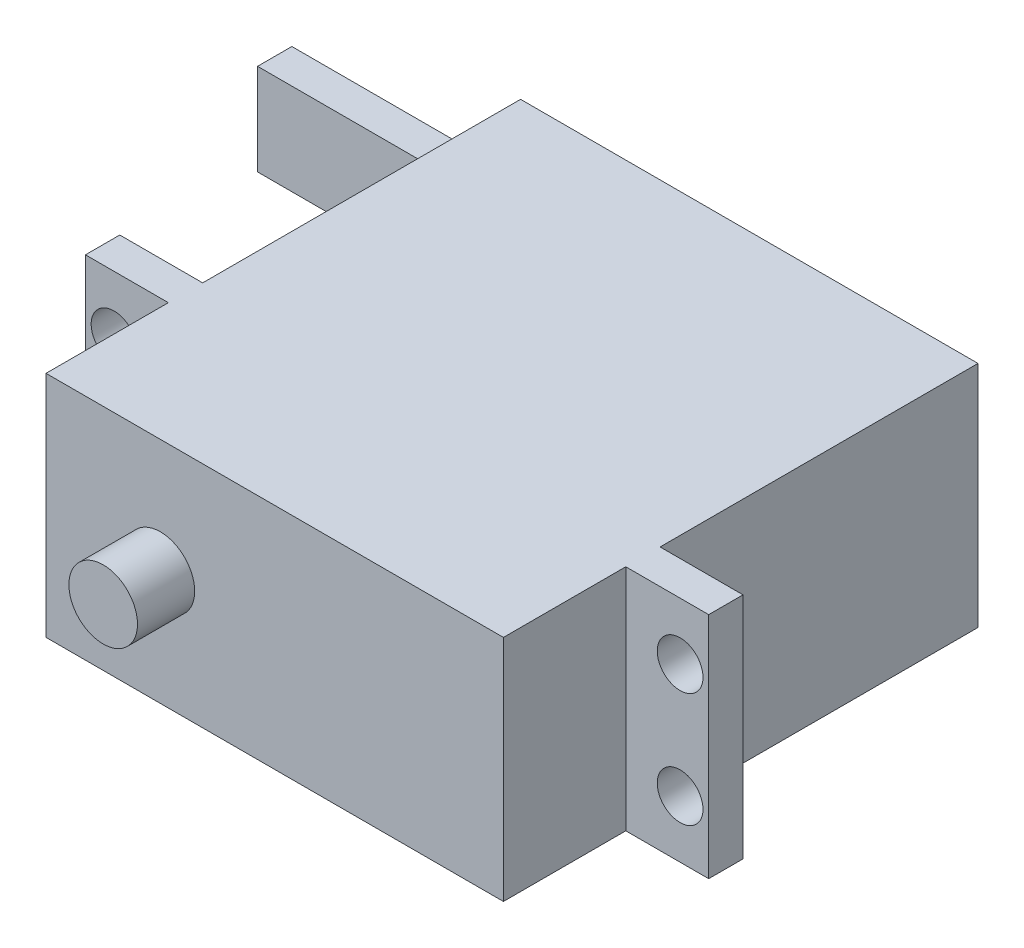
ISO-10303-21;
HEADER;
FILE_DESCRIPTION(('STEP AP214'),'2;1');
FILE_NAME('part.step','',(''),(''),'','','');
FILE_SCHEMA(('AUTOMOTIVE_DESIGN { 1 0 10303 214 1 1 1 1 }'));
ENDSEC;
DATA;
#1=APPLICATION_CONTEXT('core data for automotive mechanical design processes');
#2=APPLICATION_PROTOCOL_DEFINITION('international standard','automotive_design',2000,#1);
#3=PRODUCT_CONTEXT('',#1,'mechanical');
#4=PRODUCT('Part','Part','',(#3));
#5=PRODUCT_RELATED_PRODUCT_CATEGORY('part','',(#4));
#6=PRODUCT_DEFINITION_FORMATION('','',#4);
#7=PRODUCT_DEFINITION_CONTEXT('part definition',#1,'design');
#8=PRODUCT_DEFINITION('design','',#6,#7);
#9=PRODUCT_DEFINITION_SHAPE('','',#8);
#10=(LENGTH_UNIT() NAMED_UNIT(*) SI_UNIT(.MILLI.,.METRE.));
#11=(NAMED_UNIT(*) PLANE_ANGLE_UNIT() SI_UNIT($,.RADIAN.));
#12=(NAMED_UNIT(*) SI_UNIT($,.STERADIAN.) SOLID_ANGLE_UNIT());
#13=UNCERTAINTY_MEASURE_WITH_UNIT(LENGTH_MEASURE(1.E-05),#10,'distance_accuracy_value','');
#14=(GEOMETRIC_REPRESENTATION_CONTEXT(3) GLOBAL_UNCERTAINTY_ASSIGNED_CONTEXT((#13)) GLOBAL_UNIT_ASSIGNED_CONTEXT((#10,
#11,#12)) REPRESENTATION_CONTEXT('',''));
#15=CARTESIAN_POINT('',(0.,0.,0.));
#16=DIRECTION('',(0.,0.,1.));
#17=DIRECTION('',(1.,0.,0.));
#18=AXIS2_PLACEMENT_3D('',#15,#16,#17);
#19=CARTESIAN_POINT('',(-10.,10.,-44.));
#20=DIRECTION('',(1.,0.,0.));
#21=DIRECTION('',(0.,0.,-1.));
#22=AXIS2_PLACEMENT_3D('',#19,#20,#21);
#23=PLANE('',#22);
#24=DIRECTION('',(0.,0.,1.));
#25=VECTOR('',#24,1.);
#26=CARTESIAN_POINT('',(-10.,-4.,-44.));
#27=LINE('',#26,#25);
#28=CARTESIAN_POINT('',(-10.,-4.,-44.));
#29=VERTEX_POINT('',#28);
#30=CARTESIAN_POINT('',(-10.,-4.,-41.));
#31=VERTEX_POINT('',#30);
#32=EDGE_CURVE('E341',#29,#31,#27,.T.);
#33=ORIENTED_EDGE('',*,*,#32,.F.);
#34=DIRECTION('',(0.,1.,0.));
#35=VECTOR('',#34,1.);
#36=CARTESIAN_POINT('',(-10.,10.,-44.));
#37=LINE('',#36,#35);
#38=CARTESIAN_POINT('',(-10.,-10.,-44.));
#39=VERTEX_POINT('',#38);
#40=EDGE_CURVE('E170',#39,#29,#37,.T.);
#41=ORIENTED_EDGE('',*,*,#40,.F.);
#42=DIRECTION('',(0.,0.,1.));
#43=VECTOR('',#42,1.);
#44=CARTESIAN_POINT('',(-10.,-10.,-44.));
#45=LINE('',#44,#43);
#46=CARTESIAN_POINT('',(-10.,-10.,-16.2));
#47=VERTEX_POINT('',#46);
#48=EDGE_CURVE('E269',#39,#47,#45,.T.);
#49=ORIENTED_EDGE('',*,*,#48,.T.);
#50=DIRECTION('',(0.,-1.,0.));
#51=VECTOR('',#50,1.);
#52=CARTESIAN_POINT('',(-10.,10.,-16.2));
#53=LINE('',#52,#51);
#54=CARTESIAN_POINT('',(-10.,10.,-16.2));
#55=VERTEX_POINT('',#54);
#56=EDGE_CURVE('E201',#55,#47,#53,.T.);
#57=ORIENTED_EDGE('',*,*,#56,.F.);
#58=DIRECTION('',(0.,0.,1.));
#59=VECTOR('',#58,1.);
#60=CARTESIAN_POINT('',(-10.,10.,-44.));
#61=LINE('',#60,#59);
#62=CARTESIAN_POINT('',(-10.,10.,-44.));
#63=VERTEX_POINT('',#62);
#64=EDGE_CURVE('E265',#63,#55,#61,.T.);
#65=ORIENTED_EDGE('',*,*,#64,.F.);
#66=CARTESIAN_POINT('',(-10.,4.,-44.));
#67=VERTEX_POINT('',#66);
#68=EDGE_CURVE('E246',#67,#63,#37,.T.);
#69=ORIENTED_EDGE('',*,*,#68,.F.);
#70=DIRECTION('',(0.,0.,-1.));
#71=VECTOR('',#70,1.);
#72=CARTESIAN_POINT('',(-10.,4.,-44.));
#73=LINE('',#72,#71);
#74=CARTESIAN_POINT('',(-10.,4.,-41.));
#75=VERTEX_POINT('',#74);
#76=EDGE_CURVE('E164',#75,#67,#73,.T.);
#77=ORIENTED_EDGE('',*,*,#76,.F.);
#78=DIRECTION('',(0.,1.,0.));
#79=VECTOR('',#78,1.);
#80=CARTESIAN_POINT('',(-10.,4.,-41.));
#81=LINE('',#80,#79);
#82=EDGE_CURVE('E343',#31,#75,#81,.T.);
#83=ORIENTED_EDGE('',*,*,#82,.F.);
#84=EDGE_LOOP('',(#33,#41,#49,#57,#65,#69,#77,#83));
#85=FACE_BOUND('',#84,.T.);
#86=ADVANCED_FACE('F32',(#85),#23,.F.);
#87=CARTESIAN_POINT('',(30.,10.,-44.));
#88=DIRECTION('',(-1.,0.,0.));
#89=DIRECTION('',(0.,0.,1.));
#90=AXIS2_PLACEMENT_3D('',#87,#88,#89);
#91=PLANE('',#90);
#92=DIRECTION('',(0.,1.,0.));
#93=VECTOR('',#92,1.);
#94=CARTESIAN_POINT('',(30.,10.,-16.2));
#95=LINE('',#94,#93);
#96=CARTESIAN_POINT('',(30.,-10.,-16.2));
#97=VERTEX_POINT('',#96);
#98=CARTESIAN_POINT('',(30.,10.,-16.2));
#99=VERTEX_POINT('',#98);
#100=EDGE_CURVE('E233',#97,#99,#95,.T.);
#101=ORIENTED_EDGE('',*,*,#100,.F.);
#102=DIRECTION('',(0.,0.,1.));
#103=VECTOR('',#102,1.);
#104=CARTESIAN_POINT('',(30.,-10.,-44.));
#105=LINE('',#104,#103);
#106=CARTESIAN_POINT('',(30.,-10.,-44.));
#107=VERTEX_POINT('',#106);
#108=EDGE_CURVE('E273',#107,#97,#105,.T.);
#109=ORIENTED_EDGE('',*,*,#108,.F.);
#110=DIRECTION('',(0.,-1.,0.));
#111=VECTOR('',#110,1.);
#112=CARTESIAN_POINT('',(30.,10.,-44.));
#113=LINE('',#112,#111);
#114=CARTESIAN_POINT('',(30.,10.,-44.));
#115=VERTEX_POINT('',#114);
#116=EDGE_CURVE('E241',#115,#107,#113,.T.);
#117=ORIENTED_EDGE('',*,*,#116,.F.);
#118=DIRECTION('',(0.,0.,1.));
#119=VECTOR('',#118,1.);
#120=CARTESIAN_POINT('',(30.,10.,-44.));
#121=LINE('',#120,#119);
#122=EDGE_CURVE('E261',#115,#99,#121,.T.);
#123=ORIENTED_EDGE('',*,*,#122,.T.);
#124=EDGE_LOOP('',(#101,#109,#117,#123));
#125=FACE_BOUND('',#124,.T.);
#126=ADVANCED_FACE('F312',(#125),#91,.F.);
#127=CARTESIAN_POINT('',(0.,0.,-2.5));
#128=DIRECTION('',(0.,0.,1.));
#129=DIRECTION('',(1.,0.,0.));
#130=AXIS2_PLACEMENT_3D('',#127,#128,#129);
#131=CYLINDRICAL_SURFACE('',#130,3.);
#132=CARTESIAN_POINT('',(0.,0.,-2.5));
#133=DIRECTION('',(0.,0.,-1.));
#134=DIRECTION('',(-1.,0.,0.));
#135=AXIS2_PLACEMENT_3D('',#132,#133,#134);
#136=CIRCLE('',#135,3.);
#137=CARTESIAN_POINT('',(-3.,0.,-2.5));
#138=VERTEX_POINT('',#137);
#139=EDGE_CURVE('E41',#138,#138,#136,.F.);
#140=ORIENTED_EDGE('',*,*,#139,.T.);
#141=EDGE_LOOP('',(#140));
#142=FACE_BOUND('',#141,.T.);
#143=CARTESIAN_POINT('',(0.,0.,2.5));
#144=DIRECTION('',(0.,0.,1.));
#145=DIRECTION('',(1.,0.,0.));
#146=AXIS2_PLACEMENT_3D('',#143,#144,#145);
#147=CIRCLE('',#146,3.);
#148=CARTESIAN_POINT('',(3.,0.,2.5));
#149=VERTEX_POINT('',#148);
#150=EDGE_CURVE('E11',#149,#149,#147,.T.);
#151=ORIENTED_EDGE('',*,*,#150,.F.);
#152=EDGE_LOOP('',(#151));
#153=FACE_BOUND('',#152,.T.);
#154=ADVANCED_FACE('F34',(#142,#153),#131,.T.);
#155=CARTESIAN_POINT('',(0.,0.,2.5));
#156=DIRECTION('',(0.,0.,1.));
#157=DIRECTION('',(1.,0.,0.));
#158=AXIS2_PLACEMENT_3D('',#155,#156,#157);
#159=PLANE('',#158);
#160=ORIENTED_EDGE('',*,*,#150,.T.);
#161=EDGE_LOOP('',(#160));
#162=FACE_BOUND('',#161,.T.);
#163=ADVANCED_FACE('F388',(#162),#159,.T.);
#164=CARTESIAN_POINT('',(30.,-10.,-13.2));
#165=VERTEX_POINT('',#164);
#166=CARTESIAN_POINT('',(30.,-10.,-2.5));
#167=VERTEX_POINT('',#166);
#168=EDGE_CURVE('E272',#165,#167,#105,.T.);
#169=ORIENTED_EDGE('',*,*,#168,.F.);
#170=DIRECTION('',(0.,1.,0.));
#171=VECTOR('',#170,1.);
#172=CARTESIAN_POINT('',(30.,10.,-13.2));
#173=LINE('',#172,#171);
#174=CARTESIAN_POINT('',(30.,10.,-13.2));
#175=VERTEX_POINT('',#174);
#176=EDGE_CURVE('E222',#165,#175,#173,.T.);
#177=ORIENTED_EDGE('',*,*,#176,.T.);
#178=CARTESIAN_POINT('',(30.,10.,-2.5));
#179=VERTEX_POINT('',#178);
#180=EDGE_CURVE('E250',#175,#179,#121,.T.);
#181=ORIENTED_EDGE('',*,*,#180,.T.);
#182=DIRECTION('',(0.,-1.,0.));
#183=VECTOR('',#182,1.);
#184=CARTESIAN_POINT('',(30.,10.,-2.5));
#185=LINE('',#184,#183);
#186=EDGE_CURVE('E239',#179,#167,#185,.T.);
#187=ORIENTED_EDGE('',*,*,#186,.T.);
#188=EDGE_LOOP('',(#169,#177,#181,#187));
#189=FACE_BOUND('',#188,.T.);
#190=ADVANCED_FACE('F321',(#189),#91,.F.);
#191=CARTESIAN_POINT('',(30.,-10.,-44.));
#192=DIRECTION('',(0.,1.,0.));
#193=DIRECTION('',(0.,0.,1.));
#194=AXIS2_PLACEMENT_3D('',#191,#192,#193);
#195=PLANE('',#194);
#196=DIRECTION('',(-1.,0.,0.));
#197=VECTOR('',#196,1.);
#198=CARTESIAN_POINT('',(30.,-10.,-2.5));
#199=LINE('',#198,#197);
#200=CARTESIAN_POINT('',(-10.,-10.,-2.5));
#201=VERTEX_POINT('',#200);
#202=EDGE_CURVE('E253',#167,#201,#199,.T.);
#203=ORIENTED_EDGE('',*,*,#202,.T.);
#204=CARTESIAN_POINT('',(-10.,-10.,-13.2));
#205=VERTEX_POINT('',#204);
#206=EDGE_CURVE('E268',#205,#201,#45,.T.);
#207=ORIENTED_EDGE('',*,*,#206,.F.);
#208=DIRECTION('',(-1.,0.,0.));
#209=VECTOR('',#208,1.);
#210=CARTESIAN_POINT('',(-10.,-10.,-13.2));
#211=LINE('',#210,#209);
#212=CARTESIAN_POINT('',(-17.25,-10.,-13.2));
#213=VERTEX_POINT('',#212);
#214=EDGE_CURVE('E57',#205,#213,#211,.T.);
#215=ORIENTED_EDGE('',*,*,#214,.T.);
#216=DIRECTION('',(0.,0.,-1.));
#217=VECTOR('',#216,1.);
#218=CARTESIAN_POINT('',(-17.25,-10.,-13.2));
#219=LINE('',#218,#217);
#220=CARTESIAN_POINT('',(-17.25,-10.,-16.2));
#221=VERTEX_POINT('',#220);
#222=EDGE_CURVE('E200',#213,#221,#219,.T.);
#223=ORIENTED_EDGE('',*,*,#222,.T.);
#224=DIRECTION('',(-1.,0.,0.));
#225=VECTOR('',#224,1.);
#226=CARTESIAN_POINT('',(-10.,-10.,-16.2));
#227=LINE('',#226,#225);
#228=EDGE_CURVE('E204',#47,#221,#227,.T.);
#229=ORIENTED_EDGE('',*,*,#228,.F.);
#230=ORIENTED_EDGE('',*,*,#48,.F.);
#231=DIRECTION('',(-1.,0.,0.));
#232=VECTOR('',#231,1.);
#233=CARTESIAN_POINT('',(30.,-10.,-44.));
#234=LINE('',#233,#232);
#235=EDGE_CURVE('E243',#107,#39,#234,.T.);
#236=ORIENTED_EDGE('',*,*,#235,.F.);
#237=ORIENTED_EDGE('',*,*,#108,.T.);
#238=DIRECTION('',(-1.,0.,0.));
#239=VECTOR('',#238,1.);
#240=CARTESIAN_POINT('',(37.25,-10.,-16.2));
#241=LINE('',#240,#239);
#242=CARTESIAN_POINT('',(37.25,-10.,-16.2));
#243=VERTEX_POINT('',#242);
#244=EDGE_CURVE('E231',#243,#97,#241,.T.);
#245=ORIENTED_EDGE('',*,*,#244,.F.);
#246=DIRECTION('',(0.,0.,-1.));
#247=VECTOR('',#246,1.);
#248=CARTESIAN_POINT('',(37.25,-10.,-13.2));
#249=LINE('',#248,#247);
#250=CARTESIAN_POINT('',(37.25,-10.,-13.2));
#251=VERTEX_POINT('',#250);
#252=EDGE_CURVE('E228',#251,#243,#249,.T.);
#253=ORIENTED_EDGE('',*,*,#252,.F.);
#254=DIRECTION('',(-1.,0.,0.));
#255=VECTOR('',#254,1.);
#256=CARTESIAN_POINT('',(37.25,-10.,-13.2));
#257=LINE('',#256,#255);
#258=EDGE_CURVE('E218',#251,#165,#257,.T.);
#259=ORIENTED_EDGE('',*,*,#258,.T.);
#260=ORIENTED_EDGE('',*,*,#168,.T.);
#261=EDGE_LOOP('',(#203,#207,#215,#223,#229,#230,#236,#237,#245,#253,#259,#260));
#262=FACE_BOUND('',#261,.T.);
#263=ADVANCED_FACE('F307',(#262),#195,.F.);
#264=CARTESIAN_POINT('',(-10.,10.,-13.2));
#265=VERTEX_POINT('',#264);
#266=CARTESIAN_POINT('',(-10.,10.,-2.5));
#267=VERTEX_POINT('',#266);
#268=EDGE_CURVE('E264',#265,#267,#61,.T.);
#269=ORIENTED_EDGE('',*,*,#268,.F.);
#270=DIRECTION('',(0.,-1.,0.));
#271=VECTOR('',#270,1.);
#272=CARTESIAN_POINT('',(-10.,10.,-13.2));
#273=LINE('',#272,#271);
#274=EDGE_CURVE('E190',#265,#205,#273,.T.);
#275=ORIENTED_EDGE('',*,*,#274,.T.);
#276=ORIENTED_EDGE('',*,*,#206,.T.);
#277=DIRECTION('',(0.,1.,0.));
#278=VECTOR('',#277,1.);
#279=CARTESIAN_POINT('',(-10.,10.,-2.5));
#280=LINE('',#279,#278);
#281=EDGE_CURVE('E256',#201,#267,#280,.T.);
#282=ORIENTED_EDGE('',*,*,#281,.T.);
#283=EDGE_LOOP('',(#269,#275,#276,#282));
#284=FACE_BOUND('',#283,.T.);
#285=ADVANCED_FACE('F331',(#284),#23,.F.);
#286=CARTESIAN_POINT('',(30.,10.,-44.));
#287=DIRECTION('',(0.,-1.,0.));
#288=DIRECTION('',(0.,0.,-1.));
#289=AXIS2_PLACEMENT_3D('',#286,#287,#288);
#290=PLANE('',#289);
#291=DIRECTION('',(1.,0.,0.));
#292=VECTOR('',#291,1.);
#293=CARTESIAN_POINT('',(30.,10.,-2.5));
#294=LINE('',#293,#292);
#295=EDGE_CURVE('E244',#267,#179,#294,.T.);
#296=ORIENTED_EDGE('',*,*,#295,.T.);
#297=ORIENTED_EDGE('',*,*,#180,.F.);
#298=DIRECTION('',(1.,0.,0.));
#299=VECTOR('',#298,1.);
#300=CARTESIAN_POINT('',(37.25,10.,-13.2));
#301=LINE('',#300,#299);
#302=CARTESIAN_POINT('',(37.25,10.,-13.2));
#303=VERTEX_POINT('',#302);
#304=EDGE_CURVE('E225',#175,#303,#301,.T.);
#305=ORIENTED_EDGE('',*,*,#304,.T.);
#306=DIRECTION('',(0.,0.,-1.));
#307=VECTOR('',#306,1.);
#308=CARTESIAN_POINT('',(37.25,10.,-13.2));
#309=LINE('',#308,#307);
#310=CARTESIAN_POINT('',(37.25,10.,-16.2));
#311=VERTEX_POINT('',#310);
#312=EDGE_CURVE('E237',#303,#311,#309,.T.);
#313=ORIENTED_EDGE('',*,*,#312,.T.);
#314=DIRECTION('',(1.,0.,0.));
#315=VECTOR('',#314,1.);
#316=CARTESIAN_POINT('',(37.25,10.,-16.2));
#317=LINE('',#316,#315);
#318=EDGE_CURVE('E219',#99,#311,#317,.T.);
#319=ORIENTED_EDGE('',*,*,#318,.F.);
#320=ORIENTED_EDGE('',*,*,#122,.F.);
#321=DIRECTION('',(1.,0.,0.));
#322=VECTOR('',#321,1.);
#323=CARTESIAN_POINT('',(30.,10.,-44.));
#324=LINE('',#323,#322);
#325=EDGE_CURVE('E248',#63,#115,#324,.T.);
#326=ORIENTED_EDGE('',*,*,#325,.F.);
#327=ORIENTED_EDGE('',*,*,#64,.T.);
#328=DIRECTION('',(1.,0.,0.));
#329=VECTOR('',#328,1.);
#330=CARTESIAN_POINT('',(-10.,10.,-16.2));
#331=LINE('',#330,#329);
#332=CARTESIAN_POINT('',(-17.25,10.,-16.2));
#333=VERTEX_POINT('',#332);
#334=EDGE_CURVE('E192',#333,#55,#331,.T.);
#335=ORIENTED_EDGE('',*,*,#334,.F.);
#336=DIRECTION('',(0.,0.,-1.));
#337=VECTOR('',#336,1.);
#338=CARTESIAN_POINT('',(-17.25,10.,-13.2));
#339=LINE('',#338,#337);
#340=CARTESIAN_POINT('',(-17.25,10.,-13.2));
#341=VERTEX_POINT('',#340);
#342=EDGE_CURVE('E211',#341,#333,#339,.T.);
#343=ORIENTED_EDGE('',*,*,#342,.F.);
#344=DIRECTION('',(1.,0.,0.));
#345=VECTOR('',#344,1.);
#346=CARTESIAN_POINT('',(-10.,10.,-13.2));
#347=LINE('',#346,#345);
#348=EDGE_CURVE('E197',#341,#265,#347,.T.);
#349=ORIENTED_EDGE('',*,*,#348,.T.);
#350=ORIENTED_EDGE('',*,*,#268,.T.);
#351=EDGE_LOOP('',(#296,#297,#305,#313,#319,#320,#326,#327,#335,#343,#349,#350));
#352=FACE_BOUND('',#351,.T.);
#353=ADVANCED_FACE('F315',(#352),#290,.F.);
#354=CARTESIAN_POINT('',(0.,0.,-44.));
#355=DIRECTION('',(0.,0.,-1.));
#356=DIRECTION('',(-1.,0.,0.));
#357=AXIS2_PLACEMENT_3D('',#354,#355,#356);
#358=PLANE('',#357);
#359=ORIENTED_EDGE('',*,*,#116,.T.);
#360=ORIENTED_EDGE('',*,*,#235,.T.);
#361=ORIENTED_EDGE('',*,*,#40,.T.);
#362=DIRECTION('',(1.,0.,0.));
#363=VECTOR('',#362,1.);
#364=CARTESIAN_POINT('',(-30.,-4.,-44.));
#365=LINE('',#364,#363);
#366=CARTESIAN_POINT('',(-30.,-4.,-44.));
#367=VERTEX_POINT('',#366);
#368=EDGE_CURVE('E152',#367,#29,#365,.T.);
#369=ORIENTED_EDGE('',*,*,#368,.F.);
#370=DIRECTION('',(0.,-1.,0.));
#371=VECTOR('',#370,1.);
#372=CARTESIAN_POINT('',(-30.,4.,-44.));
#373=LINE('',#372,#371);
#374=CARTESIAN_POINT('',(-30.,4.,-44.));
#375=VERTEX_POINT('',#374);
#376=EDGE_CURVE('E159',#375,#367,#373,.T.);
#377=ORIENTED_EDGE('',*,*,#376,.F.);
#378=DIRECTION('',(1.,0.,0.));
#379=VECTOR('',#378,1.);
#380=CARTESIAN_POINT('',(-30.,4.,-44.));
#381=LINE('',#380,#379);
#382=EDGE_CURVE('E49',#375,#67,#381,.T.);
#383=ORIENTED_EDGE('',*,*,#382,.T.);
#384=ORIENTED_EDGE('',*,*,#68,.T.);
#385=ORIENTED_EDGE('',*,*,#325,.T.);
#386=EDGE_LOOP('',(#359,#360,#361,#369,#377,#383,#384,#385));
#387=FACE_BOUND('',#386,.T.);
#388=ADVANCED_FACE('F168',(#387),#358,.T.);
#389=CARTESIAN_POINT('',(0.,0.,-2.5));
#390=DIRECTION('',(0.,0.,-1.));
#391=DIRECTION('',(-1.,0.,0.));
#392=AXIS2_PLACEMENT_3D('',#389,#390,#391);
#393=PLANE('',#392);
#394=ORIENTED_EDGE('',*,*,#139,.F.);
#395=EDGE_LOOP('',(#394));
#396=FACE_BOUND('',#395,.T.);
#397=ORIENTED_EDGE('',*,*,#186,.F.);
#398=ORIENTED_EDGE('',*,*,#295,.F.);
#399=ORIENTED_EDGE('',*,*,#281,.F.);
#400=ORIENTED_EDGE('',*,*,#202,.F.);
#401=EDGE_LOOP('',(#397,#398,#399,#400));
#402=FACE_BOUND('',#401,.T.);
#403=ADVANCED_FACE('F327',(#396,#402),#393,.F.);
#404=CARTESIAN_POINT('',(37.25,10.,-13.2));
#405=DIRECTION('',(1.,0.,0.));
#406=DIRECTION('',(0.,0.,-1.));
#407=AXIS2_PLACEMENT_3D('',#404,#405,#406);
#408=PLANE('',#407);
#409=DIRECTION('',(0.,-1.,0.));
#410=VECTOR('',#409,1.);
#411=CARTESIAN_POINT('',(37.25,10.,-16.2));
#412=LINE('',#411,#410);
#413=EDGE_CURVE('E213',#311,#243,#412,.T.);
#414=ORIENTED_EDGE('',*,*,#413,.F.);
#415=ORIENTED_EDGE('',*,*,#312,.F.);
#416=DIRECTION('',(0.,-1.,0.));
#417=VECTOR('',#416,1.);
#418=CARTESIAN_POINT('',(37.25,10.,-13.2));
#419=LINE('',#418,#417);
#420=EDGE_CURVE('E215',#303,#251,#419,.T.);
#421=ORIENTED_EDGE('',*,*,#420,.T.);
#422=ORIENTED_EDGE('',*,*,#252,.T.);
#423=EDGE_LOOP('',(#414,#415,#421,#422));
#424=FACE_BOUND('',#423,.T.);
#425=ADVANCED_FACE('F303',(#424),#408,.T.);
#426=CARTESIAN_POINT('',(0.,0.,-13.2));
#427=DIRECTION('',(0.,0.,-1.));
#428=DIRECTION('',(-1.,0.,0.));
#429=AXIS2_PLACEMENT_3D('',#426,#427,#428);
#430=PLANE('',#429);
#431=CARTESIAN_POINT('',(34.75,5.,-13.2));
#432=DIRECTION('',(0.,0.,1.));
#433=DIRECTION('',(1.,0.,0.));
#434=AXIS2_PLACEMENT_3D('',#431,#432,#433);
#435=CIRCLE('',#434,2.);
#436=CARTESIAN_POINT('',(36.75,5.,-13.2));
#437=VERTEX_POINT('',#436);
#438=EDGE_CURVE('E174',#437,#437,#435,.T.);
#439=ORIENTED_EDGE('',*,*,#438,.F.);
#440=EDGE_LOOP('',(#439));
#441=FACE_BOUND('',#440,.T.);
#442=CARTESIAN_POINT('',(34.75,-5.,-13.2));
#443=DIRECTION('',(0.,0.,1.));
#444=DIRECTION('',(1.,0.,0.));
#445=AXIS2_PLACEMENT_3D('',#442,#443,#444);
#446=CIRCLE('',#445,2.);
#447=CARTESIAN_POINT('',(36.75,-5.,-13.2));
#448=VERTEX_POINT('',#447);
#449=EDGE_CURVE('E171',#448,#448,#446,.T.);
#450=ORIENTED_EDGE('',*,*,#449,.F.);
#451=EDGE_LOOP('',(#450));
#452=FACE_BOUND('',#451,.T.);
#453=ORIENTED_EDGE('',*,*,#420,.F.);
#454=ORIENTED_EDGE('',*,*,#304,.F.);
#455=ORIENTED_EDGE('',*,*,#176,.F.);
#456=ORIENTED_EDGE('',*,*,#258,.F.);
#457=EDGE_LOOP('',(#453,#454,#455,#456));
#458=FACE_BOUND('',#457,.T.);
#459=ADVANCED_FACE('F295',(#441,#452,#458),#430,.F.);
#460=CARTESIAN_POINT('',(0.,0.,-16.2));
#461=DIRECTION('',(0.,0.,-1.));
#462=DIRECTION('',(-1.,0.,0.));
#463=AXIS2_PLACEMENT_3D('',#460,#461,#462);
#464=PLANE('',#463);
#465=CARTESIAN_POINT('',(34.75,5.,-16.2));
#466=DIRECTION('',(0.,0.,-1.));
#467=DIRECTION('',(-1.,0.,0.));
#468=AXIS2_PLACEMENT_3D('',#465,#466,#467);
#469=CIRCLE('',#468,2.);
#470=CARTESIAN_POINT('',(36.75,5.,-16.2));
#471=VERTEX_POINT('',#470);
#472=EDGE_CURVE('E36',#471,#471,#469,.T.);
#473=ORIENTED_EDGE('',*,*,#472,.F.);
#474=EDGE_LOOP('',(#473));
#475=FACE_BOUND('',#474,.T.);
#476=CARTESIAN_POINT('',(34.75,-5.,-16.2));
#477=DIRECTION('',(0.,0.,-1.));
#478=DIRECTION('',(-1.,0.,0.));
#479=AXIS2_PLACEMENT_3D('',#476,#477,#478);
#480=CIRCLE('',#479,2.);
#481=CARTESIAN_POINT('',(36.75,-5.,-16.2));
#482=VERTEX_POINT('',#481);
#483=EDGE_CURVE('E281',#482,#482,#480,.T.);
#484=ORIENTED_EDGE('',*,*,#483,.F.);
#485=EDGE_LOOP('',(#484));
#486=FACE_BOUND('',#485,.T.);
#487=ORIENTED_EDGE('',*,*,#413,.T.);
#488=ORIENTED_EDGE('',*,*,#244,.T.);
#489=ORIENTED_EDGE('',*,*,#100,.T.);
#490=ORIENTED_EDGE('',*,*,#318,.T.);
#491=EDGE_LOOP('',(#487,#488,#489,#490));
#492=FACE_BOUND('',#491,.T.);
#493=ADVANCED_FACE('F291',(#475,#486,#492),#464,.T.);
#494=CARTESIAN_POINT('',(-17.25,10.,-13.2));
#495=DIRECTION('',(-1.,0.,0.));
#496=DIRECTION('',(0.,0.,1.));
#497=AXIS2_PLACEMENT_3D('',#494,#495,#496);
#498=PLANE('',#497);
#499=DIRECTION('',(0.,1.,0.));
#500=VECTOR('',#499,1.);
#501=CARTESIAN_POINT('',(-17.25,10.,-16.2));
#502=LINE('',#501,#500);
#503=EDGE_CURVE('E207',#221,#333,#502,.T.);
#504=ORIENTED_EDGE('',*,*,#503,.F.);
#505=ORIENTED_EDGE('',*,*,#222,.F.);
#506=DIRECTION('',(0.,1.,0.));
#507=VECTOR('',#506,1.);
#508=CARTESIAN_POINT('',(-17.25,10.,-13.2));
#509=LINE('',#508,#507);
#510=EDGE_CURVE('E194',#213,#341,#509,.T.);
#511=ORIENTED_EDGE('',*,*,#510,.T.);
#512=ORIENTED_EDGE('',*,*,#342,.T.);
#513=EDGE_LOOP('',(#504,#505,#511,#512));
#514=FACE_BOUND('',#513,.T.);
#515=ADVANCED_FACE('F294',(#514),#498,.T.);
#516=CARTESIAN_POINT('',(0.,0.,-13.2));
#517=DIRECTION('',(0.,0.,-1.));
#518=DIRECTION('',(-1.,0.,0.));
#519=AXIS2_PLACEMENT_3D('',#516,#517,#518);
#520=PLANE('',#519);
#521=CARTESIAN_POINT('',(-14.75,5.,-13.2));
#522=DIRECTION('',(0.,0.,1.));
#523=DIRECTION('',(1.,0.,0.));
#524=AXIS2_PLACEMENT_3D('',#521,#522,#523);
#525=CIRCLE('',#524,2.);
#526=CARTESIAN_POINT('',(-12.75,5.,-13.2));
#527=VERTEX_POINT('',#526);
#528=EDGE_CURVE('E180',#527,#527,#525,.T.);
#529=ORIENTED_EDGE('',*,*,#528,.F.);
#530=EDGE_LOOP('',(#529));
#531=FACE_BOUND('',#530,.T.);
#532=CARTESIAN_POINT('',(-14.75,-5.,-13.2));
#533=DIRECTION('',(0.,0.,1.));
#534=DIRECTION('',(1.,0.,0.));
#535=AXIS2_PLACEMENT_3D('',#532,#533,#534);
#536=CIRCLE('',#535,2.);
#537=CARTESIAN_POINT('',(-12.75,-5.,-13.2));
#538=VERTEX_POINT('',#537);
#539=EDGE_CURVE('E186',#538,#538,#536,.T.);
#540=ORIENTED_EDGE('',*,*,#539,.F.);
#541=EDGE_LOOP('',(#540));
#542=FACE_BOUND('',#541,.T.);
#543=ORIENTED_EDGE('',*,*,#274,.F.);
#544=ORIENTED_EDGE('',*,*,#348,.F.);
#545=ORIENTED_EDGE('',*,*,#510,.F.);
#546=ORIENTED_EDGE('',*,*,#214,.F.);
#547=EDGE_LOOP('',(#543,#544,#545,#546));
#548=FACE_BOUND('',#547,.T.);
#549=ADVANCED_FACE('F357',(#531,#542,#548),#520,.F.);
#550=CARTESIAN_POINT('',(0.,0.,-16.2));
#551=DIRECTION('',(0.,0.,-1.));
#552=DIRECTION('',(-1.,0.,0.));
#553=AXIS2_PLACEMENT_3D('',#550,#551,#552);
#554=PLANE('',#553);
#555=CARTESIAN_POINT('',(-14.75,5.,-16.2));
#556=DIRECTION('',(0.,0.,-1.));
#557=DIRECTION('',(-1.,0.,0.));
#558=AXIS2_PLACEMENT_3D('',#555,#556,#557);
#559=CIRCLE('',#558,2.);
#560=CARTESIAN_POINT('',(-12.75,5.,-16.2));
#561=VERTEX_POINT('',#560);
#562=EDGE_CURVE('E183',#561,#561,#559,.T.);
#563=ORIENTED_EDGE('',*,*,#562,.F.);
#564=EDGE_LOOP('',(#563));
#565=FACE_BOUND('',#564,.T.);
#566=CARTESIAN_POINT('',(-14.75,-5.,-16.2));
#567=DIRECTION('',(0.,0.,-1.));
#568=DIRECTION('',(-1.,0.,0.));
#569=AXIS2_PLACEMENT_3D('',#566,#567,#568);
#570=CIRCLE('',#569,2.);
#571=CARTESIAN_POINT('',(-12.75,-5.,-16.2));
#572=VERTEX_POINT('',#571);
#573=EDGE_CURVE('E189',#572,#572,#570,.T.);
#574=ORIENTED_EDGE('',*,*,#573,.F.);
#575=EDGE_LOOP('',(#574));
#576=FACE_BOUND('',#575,.T.);
#577=ORIENTED_EDGE('',*,*,#56,.T.);
#578=ORIENTED_EDGE('',*,*,#228,.T.);
#579=ORIENTED_EDGE('',*,*,#503,.T.);
#580=ORIENTED_EDGE('',*,*,#334,.T.);
#581=EDGE_LOOP('',(#577,#578,#579,#580));
#582=FACE_BOUND('',#581,.T.);
#583=ADVANCED_FACE('F336',(#565,#576,#582),#554,.T.);
#584=CARTESIAN_POINT('',(-14.75,-5.,-44.));
#585=DIRECTION('',(0.,0.,1.));
#586=DIRECTION('',(1.,0.,0.));
#587=AXIS2_PLACEMENT_3D('',#584,#585,#586);
#588=CYLINDRICAL_SURFACE('',#587,2.);
#589=CARTESIAN_POINT('',(-12.75,-5.,-16.2));
#590=CARTESIAN_POINT('',(-12.75,-5.,-16.16875));
#591=CARTESIAN_POINT('',(-12.75,-5.,-16.1375));
#592=CARTESIAN_POINT('',(-12.75,-5.,-16.075));
#593=CARTESIAN_POINT('',(-12.75,-5.,-16.04375));
#594=CARTESIAN_POINT('',(-12.75,-5.,-15.98125));
#595=CARTESIAN_POINT('',(-12.75,-5.,-15.95));
#596=CARTESIAN_POINT('',(-12.75,-5.,-15.8875));
#597=CARTESIAN_POINT('',(-12.75,-5.,-15.85625));
#598=CARTESIAN_POINT('',(-12.75,-5.,-15.79375));
#599=CARTESIAN_POINT('',(-12.75,-5.,-15.7625));
#600=CARTESIAN_POINT('',(-12.75,-5.,-15.7));
#601=CARTESIAN_POINT('',(-12.75,-5.,-15.66875));
#602=CARTESIAN_POINT('',(-12.75,-5.,-15.60625));
#603=CARTESIAN_POINT('',(-12.75,-5.,-15.575));
#604=CARTESIAN_POINT('',(-12.75,-5.,-15.5125));
#605=CARTESIAN_POINT('',(-12.75,-5.,-15.48125));
#606=CARTESIAN_POINT('',(-12.75,-5.,-15.41875));
#607=CARTESIAN_POINT('',(-12.75,-5.,-15.3875));
#608=CARTESIAN_POINT('',(-12.75,-5.,-15.325));
#609=CARTESIAN_POINT('',(-12.75,-5.,-15.29375));
#610=CARTESIAN_POINT('',(-12.75,-5.,-15.23125));
#611=CARTESIAN_POINT('',(-12.75,-5.,-15.2));
#612=CARTESIAN_POINT('',(-12.75,-5.,-15.1375));
#613=CARTESIAN_POINT('',(-12.75,-5.,-15.10625));
#614=CARTESIAN_POINT('',(-12.75,-5.,-15.04375));
#615=CARTESIAN_POINT('',(-12.75,-5.,-15.0125));
#616=CARTESIAN_POINT('',(-12.75,-5.,-14.95));
#617=CARTESIAN_POINT('',(-12.75,-5.,-14.91875));
#618=CARTESIAN_POINT('',(-12.75,-5.,-14.85625));
#619=CARTESIAN_POINT('',(-12.75,-5.,-14.825));
#620=CARTESIAN_POINT('',(-12.75,-5.,-14.7625));
#621=CARTESIAN_POINT('',(-12.75,-5.,-14.73125));
#622=CARTESIAN_POINT('',(-12.75,-5.,-14.66875));
#623=CARTESIAN_POINT('',(-12.75,-5.,-14.6375));
#624=CARTESIAN_POINT('',(-12.75,-5.,-14.575));
#625=CARTESIAN_POINT('',(-12.75,-5.,-14.54375));
#626=CARTESIAN_POINT('',(-12.75,-5.,-14.48125));
#627=CARTESIAN_POINT('',(-12.75,-5.,-14.45));
#628=CARTESIAN_POINT('',(-12.75,-5.,-14.3875));
#629=CARTESIAN_POINT('',(-12.75,-5.,-14.35625));
#630=CARTESIAN_POINT('',(-12.75,-5.,-14.29375));
#631=CARTESIAN_POINT('',(-12.75,-5.,-14.2625));
#632=CARTESIAN_POINT('',(-12.75,-5.,-14.2));
#633=CARTESIAN_POINT('',(-12.75,-5.,-14.16875));
#634=CARTESIAN_POINT('',(-12.75,-5.,-14.10625));
#635=CARTESIAN_POINT('',(-12.75,-5.,-14.075));
#636=CARTESIAN_POINT('',(-12.75,-5.,-14.0125));
#637=CARTESIAN_POINT('',(-12.75,-5.,-13.98125));
#638=CARTESIAN_POINT('',(-12.75,-5.,-13.91875));
#639=CARTESIAN_POINT('',(-12.75,-5.,-13.8875));
#640=CARTESIAN_POINT('',(-12.75,-5.,-13.825));
#641=CARTESIAN_POINT('',(-12.75,-5.,-13.79375));
#642=CARTESIAN_POINT('',(-12.75,-5.,-13.73125));
#643=CARTESIAN_POINT('',(-12.75,-5.,-13.7));
#644=CARTESIAN_POINT('',(-12.75,-5.,-13.6375));
#645=CARTESIAN_POINT('',(-12.75,-5.,-13.60625));
#646=CARTESIAN_POINT('',(-12.75,-5.,-13.54375));
#647=CARTESIAN_POINT('',(-12.75,-5.,-13.5125));
#648=CARTESIAN_POINT('',(-12.75,-5.,-13.45));
#649=CARTESIAN_POINT('',(-12.75,-5.,-13.41875));
#650=CARTESIAN_POINT('',(-12.75,-5.,-13.35625));
#651=CARTESIAN_POINT('',(-12.75,-5.,-13.325));
#652=CARTESIAN_POINT('',(-12.75,-5.,-13.2625));
#653=CARTESIAN_POINT('',(-12.75,-5.,-13.23125));
#654=CARTESIAN_POINT('',(-12.75,-5.,-13.2));
#655=B_SPLINE_CURVE_WITH_KNOTS('',3,(#589,#590,#591,#592,#593,#594,#595,#596,#597,#598,#599,
#600,#601,#602,#603,#604,#605,#606,#607,#608,#609,#610,#611,#612,#613,#614,#615,#616,#617,#618,
#619,#620,#621,#622,#623,#624,#625,#626,#627,#628,#629,#630,#631,#632,#633,#634,#635,#636,#637,
#638,#639,#640,#641,#642,#643,#644,#645,#646,#647,#648,#649,#650,#651,#652,#653,#654),
.UNSPECIFIED.,.F.,.F.,(4,2,2,2,2,2,2,2,2,2,2,2,2,2,2,2,2,2,2,2,2,2,2,2,2,2,2,2,2,2,2,2,4),(0.,
0.0937500000000001,0.1875,0.28125,0.375,0.46875,0.5625,0.656250000000001,0.750000000000001,
0.843749999999997,0.937499999999997,1.03125,1.125,1.21875,1.3125,1.40625,1.5,1.59375,1.6875,
1.78125,1.875,1.96875,2.0625,2.15625,2.25,2.34375,2.4375,2.53125,2.625,2.71875,2.8125,2.90625,
3.),.UNSPECIFIED.);
#656=EDGE_CURVE('BSEAM365',#572,#538,#655,.T.);
#657=ORIENTED_EDGE('',*,*,#573,.T.);
#658=ORIENTED_EDGE('',*,*,#539,.T.);
#659=ORIENTED_EDGE('',*,*,#656,.T.);
#660=ORIENTED_EDGE('',*,*,#656,.F.);
#661=EDGE_LOOP('',(#657,#659,#658,#660));
#662=FACE_BOUND('',#661,.T.);
#663=ADVANCED_FACE('F365',(#662),#588,.F.);
#664=CARTESIAN_POINT('',(-14.75,5.,-44.));
#665=DIRECTION('',(0.,0.,1.));
#666=DIRECTION('',(1.,0.,0.));
#667=AXIS2_PLACEMENT_3D('',#664,#665,#666);
#668=CYLINDRICAL_SURFACE('',#667,2.);
#669=CARTESIAN_POINT('',(-12.75,5.,-16.2));
#670=CARTESIAN_POINT('',(-12.75,5.,-16.16875));
#671=CARTESIAN_POINT('',(-12.75,5.,-16.1375));
#672=CARTESIAN_POINT('',(-12.75,5.,-16.075));
#673=CARTESIAN_POINT('',(-12.75,5.,-16.04375));
#674=CARTESIAN_POINT('',(-12.75,5.,-15.98125));
#675=CARTESIAN_POINT('',(-12.75,5.,-15.95));
#676=CARTESIAN_POINT('',(-12.75,5.,-15.8875));
#677=CARTESIAN_POINT('',(-12.75,5.,-15.85625));
#678=CARTESIAN_POINT('',(-12.75,5.,-15.79375));
#679=CARTESIAN_POINT('',(-12.75,5.,-15.7625));
#680=CARTESIAN_POINT('',(-12.75,5.,-15.7));
#681=CARTESIAN_POINT('',(-12.75,5.,-15.66875));
#682=CARTESIAN_POINT('',(-12.75,5.,-15.60625));
#683=CARTESIAN_POINT('',(-12.75,5.,-15.575));
#684=CARTESIAN_POINT('',(-12.75,5.,-15.5125));
#685=CARTESIAN_POINT('',(-12.75,5.,-15.48125));
#686=CARTESIAN_POINT('',(-12.75,5.,-15.41875));
#687=CARTESIAN_POINT('',(-12.75,5.,-15.3875));
#688=CARTESIAN_POINT('',(-12.75,5.,-15.325));
#689=CARTESIAN_POINT('',(-12.75,5.,-15.29375));
#690=CARTESIAN_POINT('',(-12.75,5.,-15.23125));
#691=CARTESIAN_POINT('',(-12.75,5.,-15.2));
#692=CARTESIAN_POINT('',(-12.75,5.,-15.1375));
#693=CARTESIAN_POINT('',(-12.75,5.,-15.10625));
#694=CARTESIAN_POINT('',(-12.75,5.,-15.04375));
#695=CARTESIAN_POINT('',(-12.75,5.,-15.0125));
#696=CARTESIAN_POINT('',(-12.75,5.,-14.95));
#697=CARTESIAN_POINT('',(-12.75,5.,-14.91875));
#698=CARTESIAN_POINT('',(-12.75,5.,-14.85625));
#699=CARTESIAN_POINT('',(-12.75,5.,-14.825));
#700=CARTESIAN_POINT('',(-12.75,5.,-14.7625));
#701=CARTESIAN_POINT('',(-12.75,5.,-14.73125));
#702=CARTESIAN_POINT('',(-12.75,5.,-14.66875));
#703=CARTESIAN_POINT('',(-12.75,5.,-14.6375));
#704=CARTESIAN_POINT('',(-12.75,5.,-14.575));
#705=CARTESIAN_POINT('',(-12.75,5.,-14.54375));
#706=CARTESIAN_POINT('',(-12.75,5.,-14.48125));
#707=CARTESIAN_POINT('',(-12.75,5.,-14.45));
#708=CARTESIAN_POINT('',(-12.75,5.,-14.3875));
#709=CARTESIAN_POINT('',(-12.75,5.,-14.35625));
#710=CARTESIAN_POINT('',(-12.75,5.,-14.29375));
#711=CARTESIAN_POINT('',(-12.75,5.,-14.2625));
#712=CARTESIAN_POINT('',(-12.75,5.,-14.2));
#713=CARTESIAN_POINT('',(-12.75,5.,-14.16875));
#714=CARTESIAN_POINT('',(-12.75,5.,-14.10625));
#715=CARTESIAN_POINT('',(-12.75,5.,-14.075));
#716=CARTESIAN_POINT('',(-12.75,5.,-14.0125));
#717=CARTESIAN_POINT('',(-12.75,5.,-13.98125));
#718=CARTESIAN_POINT('',(-12.75,5.,-13.91875));
#719=CARTESIAN_POINT('',(-12.75,5.,-13.8875));
#720=CARTESIAN_POINT('',(-12.75,5.,-13.825));
#721=CARTESIAN_POINT('',(-12.75,5.,-13.79375));
#722=CARTESIAN_POINT('',(-12.75,5.,-13.73125));
#723=CARTESIAN_POINT('',(-12.75,5.,-13.7));
#724=CARTESIAN_POINT('',(-12.75,5.,-13.6375));
#725=CARTESIAN_POINT('',(-12.75,5.,-13.60625));
#726=CARTESIAN_POINT('',(-12.75,5.,-13.54375));
#727=CARTESIAN_POINT('',(-12.75,5.,-13.5125));
#728=CARTESIAN_POINT('',(-12.75,5.,-13.45));
#729=CARTESIAN_POINT('',(-12.75,5.,-13.41875));
#730=CARTESIAN_POINT('',(-12.75,5.,-13.35625));
#731=CARTESIAN_POINT('',(-12.75,5.,-13.325));
#732=CARTESIAN_POINT('',(-12.75,5.,-13.2625));
#733=CARTESIAN_POINT('',(-12.75,5.,-13.23125));
#734=CARTESIAN_POINT('',(-12.75,5.,-13.2));
#735=B_SPLINE_CURVE_WITH_KNOTS('',3,(#669,#670,#671,#672,#673,#674,#675,#676,#677,#678,#679,
#680,#681,#682,#683,#684,#685,#686,#687,#688,#689,#690,#691,#692,#693,#694,#695,#696,#697,#698,
#699,#700,#701,#702,#703,#704,#705,#706,#707,#708,#709,#710,#711,#712,#713,#714,#715,#716,#717,
#718,#719,#720,#721,#722,#723,#724,#725,#726,#727,#728,#729,#730,#731,#732,#733,#734),
.UNSPECIFIED.,.F.,.F.,(4,2,2,2,2,2,2,2,2,2,2,2,2,2,2,2,2,2,2,2,2,2,2,2,2,2,2,2,2,2,2,2,4),(0.,
0.0937500000000001,0.1875,0.28125,0.375,0.46875,0.5625,0.656250000000001,0.750000000000001,
0.843749999999997,0.937499999999997,1.03125,1.125,1.21875,1.3125,1.40625,1.5,1.59375,1.6875,
1.78125,1.875,1.96875,2.0625,2.15625,2.25,2.34375,2.4375,2.53125,2.625,2.71875,2.8125,2.90625,
3.),.UNSPECIFIED.);
#736=EDGE_CURVE('BSEAM420',#561,#527,#735,.T.);
#737=ORIENTED_EDGE('',*,*,#562,.T.);
#738=ORIENTED_EDGE('',*,*,#528,.T.);
#739=ORIENTED_EDGE('',*,*,#736,.T.);
#740=ORIENTED_EDGE('',*,*,#736,.F.);
#741=EDGE_LOOP('',(#737,#739,#738,#740));
#742=FACE_BOUND('',#741,.T.);
#743=ADVANCED_FACE('F420',(#742),#668,.F.);
#744=CARTESIAN_POINT('',(34.75,-5.,-44.));
#745=DIRECTION('',(0.,0.,1.));
#746=DIRECTION('',(1.,0.,0.));
#747=AXIS2_PLACEMENT_3D('',#744,#745,#746);
#748=CYLINDRICAL_SURFACE('',#747,2.);
#749=CARTESIAN_POINT('',(36.75,-5.,-16.2));
#750=CARTESIAN_POINT('',(36.75,-5.,-16.16875));
#751=CARTESIAN_POINT('',(36.75,-5.,-16.1375));
#752=CARTESIAN_POINT('',(36.75,-5.,-16.075));
#753=CARTESIAN_POINT('',(36.75,-5.,-16.04375));
#754=CARTESIAN_POINT('',(36.75,-5.,-15.98125));
#755=CARTESIAN_POINT('',(36.75,-5.,-15.95));
#756=CARTESIAN_POINT('',(36.75,-5.,-15.8875));
#757=CARTESIAN_POINT('',(36.75,-5.,-15.85625));
#758=CARTESIAN_POINT('',(36.75,-5.,-15.79375));
#759=CARTESIAN_POINT('',(36.75,-5.,-15.7625));
#760=CARTESIAN_POINT('',(36.75,-5.,-15.7));
#761=CARTESIAN_POINT('',(36.75,-5.,-15.66875));
#762=CARTESIAN_POINT('',(36.75,-5.,-15.60625));
#763=CARTESIAN_POINT('',(36.75,-5.,-15.575));
#764=CARTESIAN_POINT('',(36.75,-5.,-15.5125));
#765=CARTESIAN_POINT('',(36.75,-5.,-15.48125));
#766=CARTESIAN_POINT('',(36.75,-5.,-15.41875));
#767=CARTESIAN_POINT('',(36.75,-5.,-15.3875));
#768=CARTESIAN_POINT('',(36.75,-5.,-15.325));
#769=CARTESIAN_POINT('',(36.75,-5.,-15.29375));
#770=CARTESIAN_POINT('',(36.75,-5.,-15.23125));
#771=CARTESIAN_POINT('',(36.75,-5.,-15.2));
#772=CARTESIAN_POINT('',(36.75,-5.,-15.1375));
#773=CARTESIAN_POINT('',(36.75,-5.,-15.10625));
#774=CARTESIAN_POINT('',(36.75,-5.,-15.04375));
#775=CARTESIAN_POINT('',(36.75,-5.,-15.0125));
#776=CARTESIAN_POINT('',(36.75,-5.,-14.95));
#777=CARTESIAN_POINT('',(36.75,-5.,-14.91875));
#778=CARTESIAN_POINT('',(36.75,-5.,-14.85625));
#779=CARTESIAN_POINT('',(36.75,-5.,-14.825));
#780=CARTESIAN_POINT('',(36.75,-5.,-14.7625));
#781=CARTESIAN_POINT('',(36.75,-5.,-14.73125));
#782=CARTESIAN_POINT('',(36.75,-5.,-14.66875));
#783=CARTESIAN_POINT('',(36.75,-5.,-14.6375));
#784=CARTESIAN_POINT('',(36.75,-5.,-14.575));
#785=CARTESIAN_POINT('',(36.75,-5.,-14.54375));
#786=CARTESIAN_POINT('',(36.75,-5.,-14.48125));
#787=CARTESIAN_POINT('',(36.75,-5.,-14.45));
#788=CARTESIAN_POINT('',(36.75,-5.,-14.3875));
#789=CARTESIAN_POINT('',(36.75,-5.,-14.35625));
#790=CARTESIAN_POINT('',(36.75,-5.,-14.29375));
#791=CARTESIAN_POINT('',(36.75,-5.,-14.2625));
#792=CARTESIAN_POINT('',(36.75,-5.,-14.2));
#793=CARTESIAN_POINT('',(36.75,-5.,-14.16875));
#794=CARTESIAN_POINT('',(36.75,-5.,-14.10625));
#795=CARTESIAN_POINT('',(36.75,-5.,-14.075));
#796=CARTESIAN_POINT('',(36.75,-5.,-14.0125));
#797=CARTESIAN_POINT('',(36.75,-5.,-13.98125));
#798=CARTESIAN_POINT('',(36.75,-5.,-13.91875));
#799=CARTESIAN_POINT('',(36.75,-5.,-13.8875));
#800=CARTESIAN_POINT('',(36.75,-5.,-13.825));
#801=CARTESIAN_POINT('',(36.75,-5.,-13.79375));
#802=CARTESIAN_POINT('',(36.75,-5.,-13.73125));
#803=CARTESIAN_POINT('',(36.75,-5.,-13.7));
#804=CARTESIAN_POINT('',(36.75,-5.,-13.6375));
#805=CARTESIAN_POINT('',(36.75,-5.,-13.60625));
#806=CARTESIAN_POINT('',(36.75,-5.,-13.54375));
#807=CARTESIAN_POINT('',(36.75,-5.,-13.5125));
#808=CARTESIAN_POINT('',(36.75,-5.,-13.45));
#809=CARTESIAN_POINT('',(36.75,-5.,-13.41875));
#810=CARTESIAN_POINT('',(36.75,-5.,-13.35625));
#811=CARTESIAN_POINT('',(36.75,-5.,-13.325));
#812=CARTESIAN_POINT('',(36.75,-5.,-13.2625));
#813=CARTESIAN_POINT('',(36.75,-5.,-13.23125));
#814=CARTESIAN_POINT('',(36.75,-5.,-13.2));
#815=B_SPLINE_CURVE_WITH_KNOTS('',3,(#749,#750,#751,#752,#753,#754,#755,#756,#757,#758,#759,
#760,#761,#762,#763,#764,#765,#766,#767,#768,#769,#770,#771,#772,#773,#774,#775,#776,#777,#778,
#779,#780,#781,#782,#783,#784,#785,#786,#787,#788,#789,#790,#791,#792,#793,#794,#795,#796,#797,
#798,#799,#800,#801,#802,#803,#804,#805,#806,#807,#808,#809,#810,#811,#812,#813,#814),
.UNSPECIFIED.,.F.,.F.,(4,2,2,2,2,2,2,2,2,2,2,2,2,2,2,2,2,2,2,2,2,2,2,2,2,2,2,2,2,2,2,2,4),(0.,
0.0937500000000001,0.1875,0.28125,0.375,0.46875,0.5625,0.656250000000001,0.750000000000001,
0.843749999999997,0.937499999999997,1.03125,1.125,1.21875,1.3125,1.40625,1.5,1.59375,1.6875,
1.78125,1.875,1.96875,2.0625,2.15625,2.25,2.34375,2.4375,2.53125,2.625,2.71875,2.8125,2.90625,
3.),.UNSPECIFIED.);
#816=EDGE_CURVE('BSEAM418',#482,#448,#815,.T.);
#817=ORIENTED_EDGE('',*,*,#483,.T.);
#818=ORIENTED_EDGE('',*,*,#449,.T.);
#819=ORIENTED_EDGE('',*,*,#816,.T.);
#820=ORIENTED_EDGE('',*,*,#816,.F.);
#821=EDGE_LOOP('',(#817,#819,#818,#820));
#822=FACE_BOUND('',#821,.T.);
#823=ADVANCED_FACE('F418',(#822),#748,.F.);
#824=CARTESIAN_POINT('',(34.75,5.,-44.));
#825=DIRECTION('',(0.,0.,1.));
#826=DIRECTION('',(1.,0.,0.));
#827=AXIS2_PLACEMENT_3D('',#824,#825,#826);
#828=CYLINDRICAL_SURFACE('',#827,2.);
#829=CARTESIAN_POINT('',(36.75,5.,-16.2));
#830=CARTESIAN_POINT('',(36.75,5.,-16.16875));
#831=CARTESIAN_POINT('',(36.75,5.,-16.1375));
#832=CARTESIAN_POINT('',(36.75,5.,-16.075));
#833=CARTESIAN_POINT('',(36.75,5.,-16.04375));
#834=CARTESIAN_POINT('',(36.75,5.,-15.98125));
#835=CARTESIAN_POINT('',(36.75,5.,-15.95));
#836=CARTESIAN_POINT('',(36.75,5.,-15.8875));
#837=CARTESIAN_POINT('',(36.75,5.,-15.85625));
#838=CARTESIAN_POINT('',(36.75,5.,-15.79375));
#839=CARTESIAN_POINT('',(36.75,5.,-15.7625));
#840=CARTESIAN_POINT('',(36.75,5.,-15.7));
#841=CARTESIAN_POINT('',(36.75,5.,-15.66875));
#842=CARTESIAN_POINT('',(36.75,5.,-15.60625));
#843=CARTESIAN_POINT('',(36.75,5.,-15.575));
#844=CARTESIAN_POINT('',(36.75,5.,-15.5125));
#845=CARTESIAN_POINT('',(36.75,5.,-15.48125));
#846=CARTESIAN_POINT('',(36.75,5.,-15.41875));
#847=CARTESIAN_POINT('',(36.75,5.,-15.3875));
#848=CARTESIAN_POINT('',(36.75,5.,-15.325));
#849=CARTESIAN_POINT('',(36.75,5.,-15.29375));
#850=CARTESIAN_POINT('',(36.75,5.,-15.23125));
#851=CARTESIAN_POINT('',(36.75,5.,-15.2));
#852=CARTESIAN_POINT('',(36.75,5.,-15.1375));
#853=CARTESIAN_POINT('',(36.75,5.,-15.10625));
#854=CARTESIAN_POINT('',(36.75,5.,-15.04375));
#855=CARTESIAN_POINT('',(36.75,5.,-15.0125));
#856=CARTESIAN_POINT('',(36.75,5.,-14.95));
#857=CARTESIAN_POINT('',(36.75,5.,-14.91875));
#858=CARTESIAN_POINT('',(36.75,5.,-14.85625));
#859=CARTESIAN_POINT('',(36.75,5.,-14.825));
#860=CARTESIAN_POINT('',(36.75,5.,-14.7625));
#861=CARTESIAN_POINT('',(36.75,5.,-14.73125));
#862=CARTESIAN_POINT('',(36.75,5.,-14.66875));
#863=CARTESIAN_POINT('',(36.75,5.,-14.6375));
#864=CARTESIAN_POINT('',(36.75,5.,-14.575));
#865=CARTESIAN_POINT('',(36.75,5.,-14.54375));
#866=CARTESIAN_POINT('',(36.75,5.,-14.48125));
#867=CARTESIAN_POINT('',(36.75,5.,-14.45));
#868=CARTESIAN_POINT('',(36.75,5.,-14.3875));
#869=CARTESIAN_POINT('',(36.75,5.,-14.35625));
#870=CARTESIAN_POINT('',(36.75,5.,-14.29375));
#871=CARTESIAN_POINT('',(36.75,5.,-14.2625));
#872=CARTESIAN_POINT('',(36.75,5.,-14.2));
#873=CARTESIAN_POINT('',(36.75,5.,-14.16875));
#874=CARTESIAN_POINT('',(36.75,5.,-14.10625));
#875=CARTESIAN_POINT('',(36.75,5.,-14.075));
#876=CARTESIAN_POINT('',(36.75,5.,-14.0125));
#877=CARTESIAN_POINT('',(36.75,5.,-13.98125));
#878=CARTESIAN_POINT('',(36.75,5.,-13.91875));
#879=CARTESIAN_POINT('',(36.75,5.,-13.8875));
#880=CARTESIAN_POINT('',(36.75,5.,-13.825));
#881=CARTESIAN_POINT('',(36.75,5.,-13.79375));
#882=CARTESIAN_POINT('',(36.75,5.,-13.73125));
#883=CARTESIAN_POINT('',(36.75,5.,-13.7));
#884=CARTESIAN_POINT('',(36.75,5.,-13.6375));
#885=CARTESIAN_POINT('',(36.75,5.,-13.60625));
#886=CARTESIAN_POINT('',(36.75,5.,-13.54375));
#887=CARTESIAN_POINT('',(36.75,5.,-13.5125));
#888=CARTESIAN_POINT('',(36.75,5.,-13.45));
#889=CARTESIAN_POINT('',(36.75,5.,-13.41875));
#890=CARTESIAN_POINT('',(36.75,5.,-13.35625));
#891=CARTESIAN_POINT('',(36.75,5.,-13.325));
#892=CARTESIAN_POINT('',(36.75,5.,-13.2625));
#893=CARTESIAN_POINT('',(36.75,5.,-13.23125));
#894=CARTESIAN_POINT('',(36.75,5.,-13.2));
#895=B_SPLINE_CURVE_WITH_KNOTS('',3,(#829,#830,#831,#832,#833,#834,#835,#836,#837,#838,#839,
#840,#841,#842,#843,#844,#845,#846,#847,#848,#849,#850,#851,#852,#853,#854,#855,#856,#857,#858,
#859,#860,#861,#862,#863,#864,#865,#866,#867,#868,#869,#870,#871,#872,#873,#874,#875,#876,#877,
#878,#879,#880,#881,#882,#883,#884,#885,#886,#887,#888,#889,#890,#891,#892,#893,#894),
.UNSPECIFIED.,.F.,.F.,(4,2,2,2,2,2,2,2,2,2,2,2,2,2,2,2,2,2,2,2,2,2,2,2,2,2,2,2,2,2,2,2,4),(0.,
0.0937500000000001,0.1875,0.28125,0.375,0.46875,0.5625,0.656250000000001,0.750000000000001,
0.843749999999997,0.937499999999997,1.03125,1.125,1.21875,1.3125,1.40625,1.5,1.59375,1.6875,
1.78125,1.875,1.96875,2.0625,2.15625,2.25,2.34375,2.4375,2.53125,2.625,2.71875,2.8125,2.90625,
3.),.UNSPECIFIED.);
#896=EDGE_CURVE('BSEAM288',#471,#437,#895,.T.);
#897=ORIENTED_EDGE('',*,*,#472,.T.);
#898=ORIENTED_EDGE('',*,*,#438,.T.);
#899=ORIENTED_EDGE('',*,*,#896,.T.);
#900=ORIENTED_EDGE('',*,*,#896,.F.);
#901=EDGE_LOOP('',(#897,#899,#898,#900));
#902=FACE_BOUND('',#901,.T.);
#903=ADVANCED_FACE('F288',(#902),#828,.F.);
#904=CARTESIAN_POINT('',(-30.,-4.,-44.));
#905=DIRECTION('',(0.,1.,0.));
#906=DIRECTION('',(0.,0.,1.));
#907=AXIS2_PLACEMENT_3D('',#904,#905,#906);
#908=PLANE('',#907);
#909=ORIENTED_EDGE('',*,*,#32,.T.);
#910=DIRECTION('',(1.,0.,0.));
#911=VECTOR('',#910,1.);
#912=CARTESIAN_POINT('',(-30.,-4.,-41.));
#913=LINE('',#912,#911);
#914=CARTESIAN_POINT('',(-30.,-4.,-41.));
#915=VERTEX_POINT('',#914);
#916=EDGE_CURVE('E155',#915,#31,#913,.T.);
#917=ORIENTED_EDGE('',*,*,#916,.F.);
#918=DIRECTION('',(0.,0.,1.));
#919=VECTOR('',#918,1.);
#920=CARTESIAN_POINT('',(-30.,-4.,-44.));
#921=LINE('',#920,#919);
#922=EDGE_CURVE('E148',#367,#915,#921,.T.);
#923=ORIENTED_EDGE('',*,*,#922,.F.);
#924=ORIENTED_EDGE('',*,*,#368,.T.);
#925=EDGE_LOOP('',(#909,#917,#923,#924));
#926=FACE_BOUND('',#925,.T.);
#927=ADVANCED_FACE('F150',(#926),#908,.F.);
#928=CARTESIAN_POINT('',(-30.,4.,-41.));
#929=DIRECTION('',(0.,0.,-1.));
#930=DIRECTION('',(-1.,0.,0.));
#931=AXIS2_PLACEMENT_3D('',#928,#929,#930);
#932=PLANE('',#931);
#933=ORIENTED_EDGE('',*,*,#82,.T.);
#934=DIRECTION('',(1.,0.,0.));
#935=VECTOR('',#934,1.);
#936=CARTESIAN_POINT('',(-30.,4.,-41.));
#937=LINE('',#936,#935);
#938=CARTESIAN_POINT('',(-30.,4.,-41.));
#939=VERTEX_POINT('',#938);
#940=EDGE_CURVE('E176',#939,#75,#937,.T.);
#941=ORIENTED_EDGE('',*,*,#940,.F.);
#942=DIRECTION('',(0.,1.,0.));
#943=VECTOR('',#942,1.);
#944=CARTESIAN_POINT('',(-30.,4.,-41.));
#945=LINE('',#944,#943);
#946=EDGE_CURVE('E158',#915,#939,#945,.T.);
#947=ORIENTED_EDGE('',*,*,#946,.F.);
#948=ORIENTED_EDGE('',*,*,#916,.T.);
#949=EDGE_LOOP('',(#933,#941,#947,#948));
#950=FACE_BOUND('',#949,.T.);
#951=ADVANCED_FACE('F473',(#950),#932,.F.);
#952=CARTESIAN_POINT('',(-30.,4.,-44.));
#953=DIRECTION('',(0.,-1.,0.));
#954=DIRECTION('',(0.,0.,-1.));
#955=AXIS2_PLACEMENT_3D('',#952,#953,#954);
#956=PLANE('',#955);
#957=ORIENTED_EDGE('',*,*,#76,.T.);
#958=ORIENTED_EDGE('',*,*,#382,.F.);
#959=DIRECTION('',(0.,0.,-1.));
#960=VECTOR('',#959,1.);
#961=CARTESIAN_POINT('',(-30.,4.,-44.));
#962=LINE('',#961,#960);
#963=EDGE_CURVE('E163',#939,#375,#962,.T.);
#964=ORIENTED_EDGE('',*,*,#963,.F.);
#965=ORIENTED_EDGE('',*,*,#940,.T.);
#966=EDGE_LOOP('',(#957,#958,#964,#965));
#967=FACE_BOUND('',#966,.T.);
#968=ADVANCED_FACE('F353',(#967),#956,.F.);
#969=CARTESIAN_POINT('',(-30.,0.,0.));
#970=DIRECTION('',(-1.,0.,0.));
#971=DIRECTION('',(0.,0.,1.));
#972=AXIS2_PLACEMENT_3D('',#969,#970,#971);
#973=PLANE('',#972);
#974=ORIENTED_EDGE('',*,*,#376,.T.);
#975=ORIENTED_EDGE('',*,*,#922,.T.);
#976=ORIENTED_EDGE('',*,*,#946,.T.);
#977=ORIENTED_EDGE('',*,*,#963,.T.);
#978=EDGE_LOOP('',(#974,#975,#976,#977));
#979=FACE_BOUND('',#978,.T.);
#980=ADVANCED_FACE('F161',(#979),#973,.T.);
#981=CLOSED_SHELL('',(#86,#126,#154,#163,#190,#263,#285,#353,#388,#403,#425,#459,#493,#515,#549,
#583,#663,#743,#823,#903,#927,#951,#968,#980));
#982=MANIFOLD_SOLID_BREP('B2',#981);
#983=ADVANCED_BREP_SHAPE_REPRESENTATION('',(#18,#982),#14);
#984=SHAPE_DEFINITION_REPRESENTATION(#9,#983);
ENDSEC;
END-ISO-10303-21;
